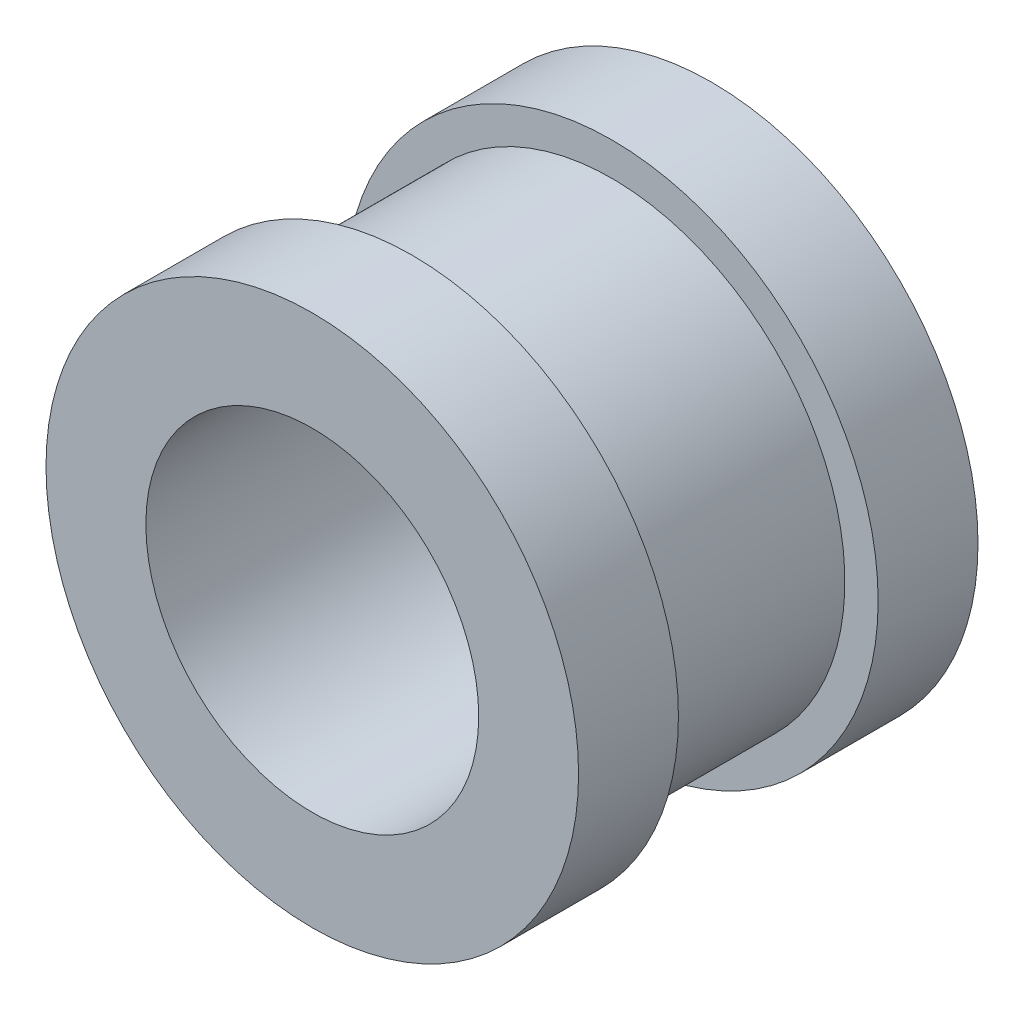
ISO-10303-21;
HEADER;
FILE_DESCRIPTION(('STEP AP214'),'2;1');
FILE_NAME('part.step','',(''),(''),'','','');
FILE_SCHEMA(('AUTOMOTIVE_DESIGN { 1 0 10303 214 1 1 1 1 }'));
ENDSEC;
DATA;
#1=APPLICATION_CONTEXT('core data for automotive mechanical design processes');
#2=APPLICATION_PROTOCOL_DEFINITION('international standard','automotive_design',2000,#1);
#3=PRODUCT_CONTEXT('',#1,'mechanical');
#4=PRODUCT('Part','Part','',(#3));
#5=PRODUCT_RELATED_PRODUCT_CATEGORY('part','',(#4));
#6=PRODUCT_DEFINITION_FORMATION('','',#4);
#7=PRODUCT_DEFINITION_CONTEXT('part definition',#1,'design');
#8=PRODUCT_DEFINITION('design','',#6,#7);
#9=PRODUCT_DEFINITION_SHAPE('','',#8);
#10=(LENGTH_UNIT() NAMED_UNIT(*) SI_UNIT(.MILLI.,.METRE.));
#11=(NAMED_UNIT(*) PLANE_ANGLE_UNIT() SI_UNIT($,.RADIAN.));
#12=(NAMED_UNIT(*) SI_UNIT($,.STERADIAN.) SOLID_ANGLE_UNIT());
#13=UNCERTAINTY_MEASURE_WITH_UNIT(LENGTH_MEASURE(1.E-05),#10,'distance_accuracy_value','');
#14=(GEOMETRIC_REPRESENTATION_CONTEXT(3) GLOBAL_UNCERTAINTY_ASSIGNED_CONTEXT((#13)) GLOBAL_UNIT_ASSIGNED_CONTEXT((#10,
#11,#12)) REPRESENTATION_CONTEXT('',''));
#15=CARTESIAN_POINT('',(0.,0.,0.));
#16=DIRECTION('',(0.,0.,1.));
#17=DIRECTION('',(1.,0.,0.));
#18=AXIS2_PLACEMENT_3D('',#15,#16,#17);
#19=CARTESIAN_POINT('',(0.,0.,12.));
#20=DIRECTION('',(0.,0.,-1.));
#21=DIRECTION('',(-1.,0.,0.));
#22=AXIS2_PLACEMENT_3D('',#19,#20,#21);
#23=CYLINDRICAL_SURFACE('',#22,8.);
#24=CARTESIAN_POINT('',(0.,0.,9.));
#25=DIRECTION('',(0.,0.,-1.));
#26=DIRECTION('',(-1.,0.,0.));
#27=AXIS2_PLACEMENT_3D('',#24,#25,#26);
#28=CIRCLE('',#27,8.);
#29=CARTESIAN_POINT('',(-8.,0.,9.));
#30=VERTEX_POINT('',#29);
#31=EDGE_CURVE('E63',#30,#30,#28,.T.);
#32=ORIENTED_EDGE('',*,*,#31,.F.);
#33=EDGE_LOOP('',(#32));
#34=FACE_BOUND('',#33,.T.);
#35=CARTESIAN_POINT('',(0.,0.,12.));
#36=DIRECTION('',(0.,0.,1.));
#37=DIRECTION('',(1.,0.,0.));
#38=AXIS2_PLACEMENT_3D('',#35,#36,#37);
#39=CIRCLE('',#38,8.);
#40=CARTESIAN_POINT('',(8.,0.,12.));
#41=VERTEX_POINT('',#40);
#42=EDGE_CURVE('E10',#41,#41,#39,.T.);
#43=ORIENTED_EDGE('',*,*,#42,.F.);
#44=EDGE_LOOP('',(#43));
#45=FACE_BOUND('',#44,.T.);
#46=ADVANCED_FACE('F43',(#34,#45),#23,.T.);
#47=CARTESIAN_POINT('',(0.,0.,12.));
#48=DIRECTION('',(0.,0.,1.));
#49=DIRECTION('',(1.,0.,0.));
#50=AXIS2_PLACEMENT_3D('',#47,#48,#49);
#51=PLANE('',#50);
#52=ORIENTED_EDGE('',*,*,#42,.T.);
#53=EDGE_LOOP('',(#52));
#54=FACE_BOUND('',#53,.T.);
#55=CARTESIAN_POINT('',(0.,0.,12.));
#56=DIRECTION('',(0.,0.,1.));
#57=DIRECTION('',(1.,0.,0.));
#58=AXIS2_PLACEMENT_3D('',#55,#56,#57);
#59=CIRCLE('',#58,5.);
#60=CARTESIAN_POINT('',(5.,0.,12.));
#61=VERTEX_POINT('',#60);
#62=EDGE_CURVE('E57',#61,#61,#59,.T.);
#63=ORIENTED_EDGE('',*,*,#62,.F.);
#64=EDGE_LOOP('',(#63));
#65=FACE_BOUND('',#64,.T.);
#66=ADVANCED_FACE('F105',(#54,#65),#51,.T.);
#67=CARTESIAN_POINT('',(0.,0.,0.));
#68=DIRECTION('',(0.,0.,1.));
#69=DIRECTION('',(1.,0.,0.));
#70=AXIS2_PLACEMENT_3D('',#67,#68,#69);
#71=PLANE('',#70);
#72=CARTESIAN_POINT('',(0.,0.,0.));
#73=DIRECTION('',(0.,0.,1.));
#74=DIRECTION('',(1.,0.,0.));
#75=AXIS2_PLACEMENT_3D('',#72,#73,#74);
#76=CIRCLE('',#75,8.);
#77=CARTESIAN_POINT('',(8.,0.,0.));
#78=VERTEX_POINT('',#77);
#79=EDGE_CURVE('E47',#78,#78,#76,.T.);
#80=ORIENTED_EDGE('',*,*,#79,.F.);
#81=EDGE_LOOP('',(#80));
#82=FACE_BOUND('',#81,.T.);
#83=CARTESIAN_POINT('',(0.,0.,0.));
#84=DIRECTION('',(0.,0.,1.));
#85=DIRECTION('',(1.,0.,0.));
#86=AXIS2_PLACEMENT_3D('',#83,#84,#85);
#87=CIRCLE('',#86,5.);
#88=CARTESIAN_POINT('',(5.,0.,0.));
#89=VERTEX_POINT('',#88);
#90=EDGE_CURVE('E59',#89,#89,#87,.T.);
#91=ORIENTED_EDGE('',*,*,#90,.T.);
#92=EDGE_LOOP('',(#91));
#93=FACE_BOUND('',#92,.T.);
#94=ADVANCED_FACE('F108',(#82,#93),#71,.F.);
#95=CARTESIAN_POINT('',(0.,0.,3.));
#96=DIRECTION('',(0.,0.,-1.));
#97=DIRECTION('',(-1.,0.,0.));
#98=AXIS2_PLACEMENT_3D('',#95,#96,#97);
#99=CIRCLE('',#98,8.);
#100=CARTESIAN_POINT('',(-8.,0.,3.));
#101=VERTEX_POINT('',#100);
#102=EDGE_CURVE('E78',#101,#101,#99,.T.);
#103=ORIENTED_EDGE('',*,*,#102,.T.);
#104=EDGE_LOOP('',(#103));
#105=FACE_BOUND('',#104,.T.);
#106=ORIENTED_EDGE('',*,*,#79,.T.);
#107=EDGE_LOOP('',(#106));
#108=FACE_BOUND('',#107,.T.);
#109=ADVANCED_FACE('F45',(#105,#108),#23,.T.);
#110=CARTESIAN_POINT('',(0.,0.,12.));
#111=DIRECTION('',(0.,0.,-1.));
#112=DIRECTION('',(-1.,0.,0.));
#113=AXIS2_PLACEMENT_3D('',#110,#111,#112);
#114=CYLINDRICAL_SURFACE('',#113,5.);
#115=ORIENTED_EDGE('',*,*,#62,.T.);
#116=EDGE_LOOP('',(#115));
#117=FACE_BOUND('',#116,.T.);
#118=ORIENTED_EDGE('',*,*,#90,.F.);
#119=EDGE_LOOP('',(#118));
#120=FACE_BOUND('',#119,.T.);
#121=ADVANCED_FACE('F99',(#117,#120),#114,.F.);
#122=CARTESIAN_POINT('',(-8.,0.,9.));
#123=DIRECTION('',(0.,0.,1.));
#124=DIRECTION('',(1.,0.,0.));
#125=AXIS2_PLACEMENT_3D('',#122,#123,#124);
#126=PLANE('',#125);
#127=CARTESIAN_POINT('',(0.,0.,9.));
#128=DIRECTION('',(0.,0.,-1.));
#129=DIRECTION('',(-1.,0.,0.));
#130=AXIS2_PLACEMENT_3D('',#127,#128,#129);
#131=CIRCLE('',#130,7.);
#132=CARTESIAN_POINT('',(-7.,0.,9.));
#133=VERTEX_POINT('',#132);
#134=EDGE_CURVE('E70',#133,#133,#131,.T.);
#135=ORIENTED_EDGE('',*,*,#134,.F.);
#136=EDGE_LOOP('',(#135));
#137=FACE_BOUND('',#136,.T.);
#138=ORIENTED_EDGE('',*,*,#31,.T.);
#139=EDGE_LOOP('',(#138));
#140=FACE_BOUND('',#139,.T.);
#141=ADVANCED_FACE('F93',(#137,#140),#126,.F.);
#142=CARTESIAN_POINT('',(0.,0.,-2.73019663528322));
#143=DIRECTION('',(0.,0.,-1.));
#144=DIRECTION('',(-1.,0.,0.));
#145=AXIS2_PLACEMENT_3D('',#142,#143,#144);
#146=CYLINDRICAL_SURFACE('',#145,7.);
#147=CARTESIAN_POINT('',(0.,0.,3.));
#148=DIRECTION('',(0.,0.,-1.));
#149=DIRECTION('',(-1.,0.,0.));
#150=AXIS2_PLACEMENT_3D('',#147,#148,#149);
#151=CIRCLE('',#150,7.);
#152=CARTESIAN_POINT('',(-7.,0.,3.));
#153=VERTEX_POINT('',#152);
#154=EDGE_CURVE('E74',#153,#153,#151,.T.);
#155=ORIENTED_EDGE('',*,*,#154,.F.);
#156=EDGE_LOOP('',(#155));
#157=FACE_BOUND('',#156,.T.);
#158=ORIENTED_EDGE('',*,*,#134,.T.);
#159=EDGE_LOOP('',(#158));
#160=FACE_BOUND('',#159,.T.);
#161=ADVANCED_FACE('F87',(#157,#160),#146,.T.);
#162=CARTESIAN_POINT('',(-8.,0.,3.));
#163=DIRECTION('',(0.,0.,-1.));
#164=DIRECTION('',(-1.,0.,0.));
#165=AXIS2_PLACEMENT_3D('',#162,#163,#164);
#166=PLANE('',#165);
#167=ORIENTED_EDGE('',*,*,#102,.F.);
#168=EDGE_LOOP('',(#167));
#169=FACE_BOUND('',#168,.T.);
#170=ORIENTED_EDGE('',*,*,#154,.T.);
#171=EDGE_LOOP('',(#170));
#172=FACE_BOUND('',#171,.T.);
#173=ADVANCED_FACE('F84',(#169,#172),#166,.F.);
#174=CLOSED_SHELL('',(#46,#66,#94,#109,#121,#141,#161,#173));
#175=MANIFOLD_SOLID_BREP('B2',#174);
#176=ADVANCED_BREP_SHAPE_REPRESENTATION('',(#18,#175),#14);
#177=SHAPE_DEFINITION_REPRESENTATION(#9,#176);
ENDSEC;
END-ISO-10303-21;
